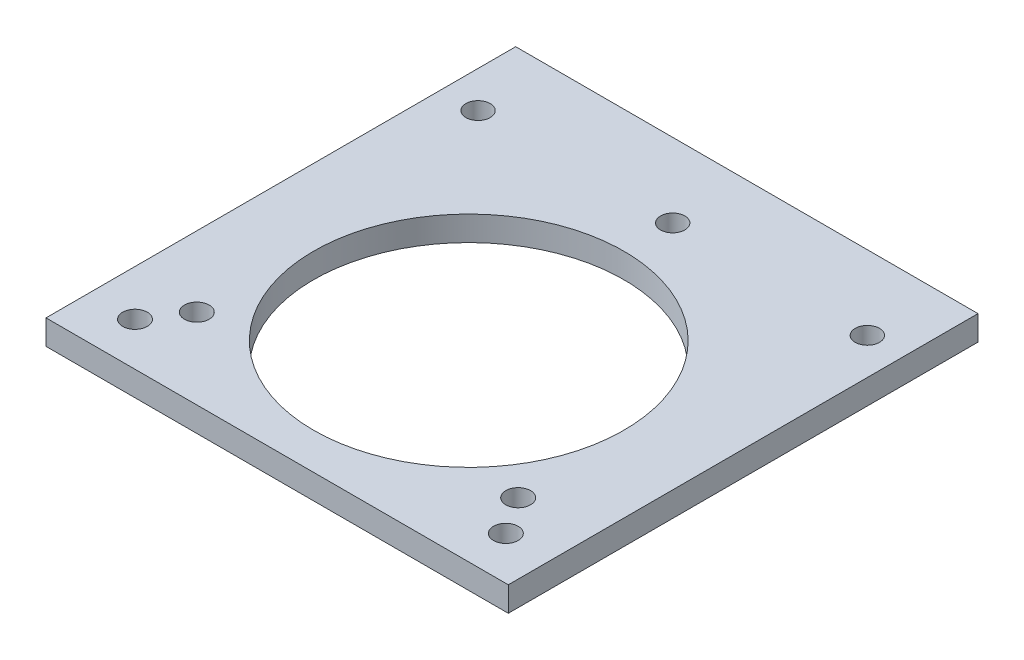
ISO-10303-21;
HEADER;
FILE_DESCRIPTION(('STEP AP214'),'2;1');
FILE_NAME('part.step','',(''),(''),'','','');
FILE_SCHEMA(('AUTOMOTIVE_DESIGN { 1 0 10303 214 1 1 1 1 }'));
ENDSEC;
DATA;
#1=APPLICATION_CONTEXT('core data for automotive mechanical design processes');
#2=APPLICATION_PROTOCOL_DEFINITION('international standard','automotive_design',2000,#1);
#3=PRODUCT_CONTEXT('',#1,'mechanical');
#4=PRODUCT('Part','Part','',(#3));
#5=PRODUCT_RELATED_PRODUCT_CATEGORY('part','',(#4));
#6=PRODUCT_DEFINITION_FORMATION('','',#4);
#7=PRODUCT_DEFINITION_CONTEXT('part definition',#1,'design');
#8=PRODUCT_DEFINITION('design','',#6,#7);
#9=PRODUCT_DEFINITION_SHAPE('','',#8);
#10=(LENGTH_UNIT() NAMED_UNIT(*) SI_UNIT(.MILLI.,.METRE.));
#11=(NAMED_UNIT(*) PLANE_ANGLE_UNIT() SI_UNIT($,.RADIAN.));
#12=(NAMED_UNIT(*) SI_UNIT($,.STERADIAN.) SOLID_ANGLE_UNIT());
#13=UNCERTAINTY_MEASURE_WITH_UNIT(LENGTH_MEASURE(1.E-05),#10,'distance_accuracy_value','');
#14=(GEOMETRIC_REPRESENTATION_CONTEXT(3) GLOBAL_UNCERTAINTY_ASSIGNED_CONTEXT((#13)) GLOBAL_UNIT_ASSIGNED_CONTEXT((#10,
#11,#12)) REPRESENTATION_CONTEXT('',''));
#15=CARTESIAN_POINT('',(0.,0.,0.));
#16=DIRECTION('',(0.,0.,1.));
#17=DIRECTION('',(1.,0.,0.));
#18=AXIS2_PLACEMENT_3D('',#15,#16,#17);
#19=CARTESIAN_POINT('',(-47.5,5.08,-35.56));
#20=DIRECTION('',(0.,0.,1.));
#21=DIRECTION('',(1.,0.,0.));
#22=AXIS2_PLACEMENT_3D('',#19,#20,#21);
#23=PLANE('',#22);
#24=DIRECTION('',(-1.,0.,0.));
#25=VECTOR('',#24,1.);
#26=CARTESIAN_POINT('',(-47.5,0.,-35.56));
#27=LINE('',#26,#25);
#28=CARTESIAN_POINT('',(47.5,0.,-35.56));
#29=VERTEX_POINT('',#28);
#30=CARTESIAN_POINT('',(-47.5,0.,-35.56));
#31=VERTEX_POINT('',#30);
#32=EDGE_CURVE('E116',#29,#31,#27,.T.);
#33=ORIENTED_EDGE('',*,*,#32,.T.);
#34=DIRECTION('',(0.,-1.,0.));
#35=VECTOR('',#34,1.);
#36=CARTESIAN_POINT('',(-47.5,5.08,-35.56));
#37=LINE('',#36,#35);
#38=CARTESIAN_POINT('',(-47.5,5.08,-35.56));
#39=VERTEX_POINT('',#38);
#40=EDGE_CURVE('E11',#39,#31,#37,.T.);
#41=ORIENTED_EDGE('',*,*,#40,.F.);
#42=DIRECTION('',(-1.,0.,0.));
#43=VECTOR('',#42,1.);
#44=CARTESIAN_POINT('',(-47.5,5.08,-35.56));
#45=LINE('',#44,#43);
#46=CARTESIAN_POINT('',(47.5,5.08,-35.56));
#47=VERTEX_POINT('',#46);
#48=EDGE_CURVE('E99',#47,#39,#45,.T.);
#49=ORIENTED_EDGE('',*,*,#48,.F.);
#50=DIRECTION('',(0.,-1.,0.));
#51=VECTOR('',#50,1.);
#52=CARTESIAN_POINT('',(47.5,5.08,-35.56));
#53=LINE('',#52,#51);
#54=EDGE_CURVE('E112',#47,#29,#53,.T.);
#55=ORIENTED_EDGE('',*,*,#54,.T.);
#56=EDGE_LOOP('',(#33,#41,#49,#55));
#57=FACE_BOUND('',#56,.T.);
#58=ADVANCED_FACE('F45',(#57),#23,.F.);
#59=CARTESIAN_POINT('',(-47.5,5.08,60.96));
#60=DIRECTION('',(1.,0.,0.));
#61=DIRECTION('',(0.,0.,-1.));
#62=AXIS2_PLACEMENT_3D('',#59,#60,#61);
#63=PLANE('',#62);
#64=DIRECTION('',(0.,0.,1.));
#65=VECTOR('',#64,1.);
#66=CARTESIAN_POINT('',(-47.5,0.,60.96));
#67=LINE('',#66,#65);
#68=CARTESIAN_POINT('',(-47.5,0.,60.96));
#69=VERTEX_POINT('',#68);
#70=EDGE_CURVE('E104',#31,#69,#67,.T.);
#71=ORIENTED_EDGE('',*,*,#70,.T.);
#72=DIRECTION('',(0.,-1.,0.));
#73=VECTOR('',#72,1.);
#74=CARTESIAN_POINT('',(-47.5,5.08,60.96));
#75=LINE('',#74,#73);
#76=CARTESIAN_POINT('',(-47.5,5.08,60.96));
#77=VERTEX_POINT('',#76);
#78=EDGE_CURVE('E55',#77,#69,#75,.T.);
#79=ORIENTED_EDGE('',*,*,#78,.F.);
#80=DIRECTION('',(0.,0.,1.));
#81=VECTOR('',#80,1.);
#82=CARTESIAN_POINT('',(-47.5,5.08,60.96));
#83=LINE('',#82,#81);
#84=EDGE_CURVE('E94',#39,#77,#83,.T.);
#85=ORIENTED_EDGE('',*,*,#84,.F.);
#86=ORIENTED_EDGE('',*,*,#40,.T.);
#87=EDGE_LOOP('',(#71,#79,#85,#86));
#88=FACE_BOUND('',#87,.T.);
#89=ADVANCED_FACE('F103',(#88),#63,.F.);
#90=CARTESIAN_POINT('',(-47.5,5.08,60.96));
#91=DIRECTION('',(0.,0.,-1.));
#92=DIRECTION('',(-1.,0.,0.));
#93=AXIS2_PLACEMENT_3D('',#90,#91,#92);
#94=PLANE('',#93);
#95=DIRECTION('',(1.,0.,0.));
#96=VECTOR('',#95,1.);
#97=CARTESIAN_POINT('',(-47.5,0.,60.96));
#98=LINE('',#97,#96);
#99=CARTESIAN_POINT('',(47.5,0.,60.96));
#100=VERTEX_POINT('',#99);
#101=EDGE_CURVE('E81',#69,#100,#98,.T.);
#102=ORIENTED_EDGE('',*,*,#101,.T.);
#103=DIRECTION('',(0.,-1.,0.));
#104=VECTOR('',#103,1.);
#105=CARTESIAN_POINT('',(47.5,5.08,60.96));
#106=LINE('',#105,#104);
#107=CARTESIAN_POINT('',(47.5,5.08,60.96));
#108=VERTEX_POINT('',#107);
#109=EDGE_CURVE('E106',#108,#100,#106,.T.);
#110=ORIENTED_EDGE('',*,*,#109,.F.);
#111=DIRECTION('',(1.,0.,0.));
#112=VECTOR('',#111,1.);
#113=CARTESIAN_POINT('',(-47.5,5.08,60.96));
#114=LINE('',#113,#112);
#115=EDGE_CURVE('E97',#77,#108,#114,.T.);
#116=ORIENTED_EDGE('',*,*,#115,.F.);
#117=ORIENTED_EDGE('',*,*,#78,.T.);
#118=EDGE_LOOP('',(#102,#110,#116,#117));
#119=FACE_BOUND('',#118,.T.);
#120=ADVANCED_FACE('F108',(#119),#94,.F.);
#121=CARTESIAN_POINT('',(47.5,5.08,60.96));
#122=DIRECTION('',(-1.,0.,0.));
#123=DIRECTION('',(0.,0.,1.));
#124=AXIS2_PLACEMENT_3D('',#121,#122,#123);
#125=PLANE('',#124);
#126=DIRECTION('',(0.,0.,-1.));
#127=VECTOR('',#126,1.);
#128=CARTESIAN_POINT('',(47.5,0.,60.96));
#129=LINE('',#128,#127);
#130=EDGE_CURVE('E87',#100,#29,#129,.T.);
#131=ORIENTED_EDGE('',*,*,#130,.T.);
#132=ORIENTED_EDGE('',*,*,#54,.F.);
#133=DIRECTION('',(0.,0.,-1.));
#134=VECTOR('',#133,1.);
#135=CARTESIAN_POINT('',(47.5,5.08,60.96));
#136=LINE('',#135,#134);
#137=EDGE_CURVE('E64',#108,#47,#136,.T.);
#138=ORIENTED_EDGE('',*,*,#137,.F.);
#139=ORIENTED_EDGE('',*,*,#109,.T.);
#140=EDGE_LOOP('',(#131,#132,#138,#139));
#141=FACE_BOUND('',#140,.T.);
#142=ADVANCED_FACE('F190',(#141),#125,.F.);
#143=CARTESIAN_POINT('',(0.,5.08,0.));
#144=DIRECTION('',(0.,1.,0.));
#145=DIRECTION('',(0.,0.,1.));
#146=AXIS2_PLACEMENT_3D('',#143,#144,#145);
#147=PLANE('',#146);
#148=CARTESIAN_POINT('',(33.02,5.08,44.45));
#149=DIRECTION('',(0.,1.,0.));
#150=DIRECTION('',(0.,0.,-1.));
#151=AXIS2_PLACEMENT_3D('',#148,#149,#150);
#152=CIRCLE('',#151,2.54);
#153=CARTESIAN_POINT('',(33.02,5.08,41.91));
#154=VERTEX_POINT('',#153);
#155=EDGE_CURVE('E301',#154,#154,#152,.T.);
#156=ORIENTED_EDGE('',*,*,#155,.F.);
#157=EDGE_LOOP('',(#156));
#158=FACE_BOUND('',#157,.T.);
#159=CARTESIAN_POINT('',(-38.1,5.08,52.07));
#160=DIRECTION('',(0.,1.,0.));
#161=DIRECTION('',(0.,0.,1.));
#162=AXIS2_PLACEMENT_3D('',#159,#160,#161);
#163=CIRCLE('',#162,2.54);
#164=CARTESIAN_POINT('',(-38.1,5.08,54.61));
#165=VERTEX_POINT('',#164);
#166=EDGE_CURVE('E303',#165,#165,#163,.T.);
#167=ORIENTED_EDGE('',*,*,#166,.F.);
#168=EDGE_LOOP('',(#167));
#169=FACE_BOUND('',#168,.T.);
#170=CARTESIAN_POINT('',(38.1,5.08,52.07));
#171=DIRECTION('',(0.,1.,0.));
#172=DIRECTION('',(0.,0.,-1.));
#173=AXIS2_PLACEMENT_3D('',#170,#171,#172);
#174=CIRCLE('',#173,2.54);
#175=CARTESIAN_POINT('',(38.1,5.08,49.53));
#176=VERTEX_POINT('',#175);
#177=EDGE_CURVE('E309',#176,#176,#174,.T.);
#178=ORIENTED_EDGE('',*,*,#177,.F.);
#179=EDGE_LOOP('',(#178));
#180=FACE_BOUND('',#179,.T.);
#181=CARTESIAN_POINT('',(-33.02,5.08,44.45));
#182=DIRECTION('',(0.,1.,0.));
#183=DIRECTION('',(0.,0.,1.));
#184=AXIS2_PLACEMENT_3D('',#181,#182,#183);
#185=CIRCLE('',#184,2.54);
#186=CARTESIAN_POINT('',(-33.02,5.08,46.99));
#187=VERTEX_POINT('',#186);
#188=EDGE_CURVE('E136',#187,#187,#185,.T.);
#189=ORIENTED_EDGE('',*,*,#188,.F.);
#190=EDGE_LOOP('',(#189));
#191=FACE_BOUND('',#190,.T.);
#192=CARTESIAN_POINT('',(-40.,5.08,-20.32));
#193=DIRECTION('',(0.,1.,0.));
#194=DIRECTION('',(0.,0.,1.));
#195=AXIS2_PLACEMENT_3D('',#192,#193,#194);
#196=CIRCLE('',#195,2.5);
#197=CARTESIAN_POINT('',(-40.,5.08,-17.82));
#198=VERTEX_POINT('',#197);
#199=EDGE_CURVE('E146',#198,#198,#196,.T.);
#200=ORIENTED_EDGE('',*,*,#199,.F.);
#201=EDGE_LOOP('',(#200));
#202=FACE_BOUND('',#201,.T.);
#203=CARTESIAN_POINT('',(40.,5.08,-20.32));
#204=DIRECTION('',(0.,1.,0.));
#205=DIRECTION('',(0.,0.,1.));
#206=AXIS2_PLACEMENT_3D('',#203,#204,#205);
#207=CIRCLE('',#206,2.5);
#208=CARTESIAN_POINT('',(40.,5.08,-17.82));
#209=VERTEX_POINT('',#208);
#210=EDGE_CURVE('E157',#209,#209,#207,.T.);
#211=ORIENTED_EDGE('',*,*,#210,.F.);
#212=EDGE_LOOP('',(#211));
#213=FACE_BOUND('',#212,.T.);
#214=CARTESIAN_POINT('',(0.,5.08,-20.32));
#215=DIRECTION('',(0.,1.,0.));
#216=DIRECTION('',(0.,0.,1.));
#217=AXIS2_PLACEMENT_3D('',#214,#215,#216);
#218=CIRCLE('',#217,2.5);
#219=CARTESIAN_POINT('',(0.,5.08,-17.82));
#220=VERTEX_POINT('',#219);
#221=EDGE_CURVE('E169',#220,#220,#218,.T.);
#222=ORIENTED_EDGE('',*,*,#221,.F.);
#223=EDGE_LOOP('',(#222));
#224=FACE_BOUND('',#223,.T.);
#225=CARTESIAN_POINT('',(0.,5.08,21.59));
#226=DIRECTION('',(0.,1.,0.));
#227=DIRECTION('',(0.,0.,1.));
#228=AXIS2_PLACEMENT_3D('',#225,#226,#227);
#229=CIRCLE('',#228,31.88);
#230=CARTESIAN_POINT('',(0.,5.08,53.47));
#231=VERTEX_POINT('',#230);
#232=EDGE_CURVE('E177',#231,#231,#229,.T.);
#233=ORIENTED_EDGE('',*,*,#232,.F.);
#234=EDGE_LOOP('',(#233));
#235=FACE_BOUND('',#234,.T.);
#236=ORIENTED_EDGE('',*,*,#48,.T.);
#237=ORIENTED_EDGE('',*,*,#84,.T.);
#238=ORIENTED_EDGE('',*,*,#115,.T.);
#239=ORIENTED_EDGE('',*,*,#137,.T.);
#240=EDGE_LOOP('',(#236,#237,#238,#239));
#241=FACE_BOUND('',#240,.T.);
#242=ADVANCED_FACE('F95',(#158,#169,#180,#191,#202,#213,#224,#235,#241),#147,.T.);
#243=CARTESIAN_POINT('',(0.,0.,0.));
#244=DIRECTION('',(0.,1.,0.));
#245=DIRECTION('',(0.,0.,1.));
#246=AXIS2_PLACEMENT_3D('',#243,#244,#245);
#247=PLANE('',#246);
#248=CARTESIAN_POINT('',(33.02,0.,44.45));
#249=DIRECTION('',(0.,1.,0.));
#250=DIRECTION('',(0.,0.,1.));
#251=AXIS2_PLACEMENT_3D('',#248,#249,#250);
#252=CIRCLE('',#251,2.54);
#253=CARTESIAN_POINT('',(33.02,0.,46.99));
#254=VERTEX_POINT('',#253);
#255=EDGE_CURVE('E48',#254,#254,#252,.T.);
#256=ORIENTED_EDGE('',*,*,#255,.T.);
#257=EDGE_LOOP('',(#256));
#258=FACE_BOUND('',#257,.T.);
#259=CARTESIAN_POINT('',(-38.1,0.,52.07));
#260=DIRECTION('',(0.,1.,0.));
#261=DIRECTION('',(0.,0.,1.));
#262=AXIS2_PLACEMENT_3D('',#259,#260,#261);
#263=CIRCLE('',#262,2.54);
#264=CARTESIAN_POINT('',(-38.1,0.,54.61));
#265=VERTEX_POINT('',#264);
#266=EDGE_CURVE('E139',#265,#265,#263,.T.);
#267=ORIENTED_EDGE('',*,*,#266,.T.);
#268=EDGE_LOOP('',(#267));
#269=FACE_BOUND('',#268,.T.);
#270=CARTESIAN_POINT('',(38.1,0.,52.07));
#271=DIRECTION('',(0.,1.,0.));
#272=DIRECTION('',(0.,0.,1.));
#273=AXIS2_PLACEMENT_3D('',#270,#271,#272);
#274=CIRCLE('',#273,2.54);
#275=CARTESIAN_POINT('',(38.1,0.,54.61));
#276=VERTEX_POINT('',#275);
#277=EDGE_CURVE('E135',#276,#276,#274,.T.);
#278=ORIENTED_EDGE('',*,*,#277,.T.);
#279=EDGE_LOOP('',(#278));
#280=FACE_BOUND('',#279,.T.);
#281=CARTESIAN_POINT('',(-33.02,0.,44.45));
#282=DIRECTION('',(0.,1.,0.));
#283=DIRECTION('',(0.,0.,1.));
#284=AXIS2_PLACEMENT_3D('',#281,#282,#283);
#285=CIRCLE('',#284,2.54);
#286=CARTESIAN_POINT('',(-33.02,0.,46.99));
#287=VERTEX_POINT('',#286);
#288=EDGE_CURVE('E131',#287,#287,#285,.T.);
#289=ORIENTED_EDGE('',*,*,#288,.T.);
#290=EDGE_LOOP('',(#289));
#291=FACE_BOUND('',#290,.T.);
#292=CARTESIAN_POINT('',(-40.,0.,-20.32));
#293=DIRECTION('',(0.,1.,0.));
#294=DIRECTION('',(0.,0.,1.));
#295=AXIS2_PLACEMENT_3D('',#292,#293,#294);
#296=CIRCLE('',#295,2.5);
#297=CARTESIAN_POINT('',(-40.,0.,-17.82));
#298=VERTEX_POINT('',#297);
#299=EDGE_CURVE('E151',#298,#298,#296,.T.);
#300=ORIENTED_EDGE('',*,*,#299,.T.);
#301=EDGE_LOOP('',(#300));
#302=FACE_BOUND('',#301,.T.);
#303=CARTESIAN_POINT('',(40.,0.,-20.32));
#304=DIRECTION('',(0.,1.,0.));
#305=DIRECTION('',(0.,0.,1.));
#306=AXIS2_PLACEMENT_3D('',#303,#304,#305);
#307=CIRCLE('',#306,2.5);
#308=CARTESIAN_POINT('',(40.,0.,-17.82));
#309=VERTEX_POINT('',#308);
#310=EDGE_CURVE('E165',#309,#309,#307,.T.);
#311=ORIENTED_EDGE('',*,*,#310,.T.);
#312=EDGE_LOOP('',(#311));
#313=FACE_BOUND('',#312,.T.);
#314=CARTESIAN_POINT('',(0.,0.,-20.32));
#315=DIRECTION('',(0.,1.,0.));
#316=DIRECTION('',(0.,0.,1.));
#317=AXIS2_PLACEMENT_3D('',#314,#315,#316);
#318=CIRCLE('',#317,2.5);
#319=CARTESIAN_POINT('',(0.,0.,-17.82));
#320=VERTEX_POINT('',#319);
#321=EDGE_CURVE('E173',#320,#320,#318,.T.);
#322=ORIENTED_EDGE('',*,*,#321,.T.);
#323=EDGE_LOOP('',(#322));
#324=FACE_BOUND('',#323,.T.);
#325=CARTESIAN_POINT('',(0.,0.,21.59));
#326=DIRECTION('',(0.,1.,0.));
#327=DIRECTION('',(0.,0.,1.));
#328=AXIS2_PLACEMENT_3D('',#325,#326,#327);
#329=CIRCLE('',#328,31.88);
#330=CARTESIAN_POINT('',(0.,0.,53.47));
#331=VERTEX_POINT('',#330);
#332=EDGE_CURVE('E120',#331,#331,#329,.T.);
#333=ORIENTED_EDGE('',*,*,#332,.T.);
#334=EDGE_LOOP('',(#333));
#335=FACE_BOUND('',#334,.T.);
#336=ORIENTED_EDGE('',*,*,#32,.F.);
#337=ORIENTED_EDGE('',*,*,#130,.F.);
#338=ORIENTED_EDGE('',*,*,#101,.F.);
#339=ORIENTED_EDGE('',*,*,#70,.F.);
#340=EDGE_LOOP('',(#336,#337,#338,#339));
#341=FACE_BOUND('',#340,.T.);
#342=ADVANCED_FACE('F189',(#258,#269,#280,#291,#302,#313,#324,#335,#341),#247,.F.);
#343=CARTESIAN_POINT('',(0.,0.,21.59));
#344=DIRECTION('',(0.,1.,0.));
#345=DIRECTION('',(0.,0.,1.));
#346=AXIS2_PLACEMENT_3D('',#343,#344,#345);
#347=CYLINDRICAL_SURFACE('',#346,31.88);
#348=ORIENTED_EDGE('',*,*,#332,.F.);
#349=EDGE_LOOP('',(#348));
#350=FACE_BOUND('',#349,.T.);
#351=ORIENTED_EDGE('',*,*,#232,.T.);
#352=EDGE_LOOP('',(#351));
#353=FACE_BOUND('',#352,.T.);
#354=ADVANCED_FACE('F186',(#350,#353),#347,.F.);
#355=CARTESIAN_POINT('',(0.,5.08,-20.32));
#356=DIRECTION('',(0.,1.,0.));
#357=DIRECTION('',(0.,0.,1.));
#358=AXIS2_PLACEMENT_3D('',#355,#356,#357);
#359=CYLINDRICAL_SURFACE('',#358,2.5);
#360=ORIENTED_EDGE('',*,*,#321,.F.);
#361=EDGE_LOOP('',(#360));
#362=FACE_BOUND('',#361,.T.);
#363=ORIENTED_EDGE('',*,*,#221,.T.);
#364=EDGE_LOOP('',(#363));
#365=FACE_BOUND('',#364,.T.);
#366=ADVANCED_FACE('F228',(#362,#365),#359,.F.);
#367=CARTESIAN_POINT('',(40.,5.08,-20.32));
#368=DIRECTION('',(0.,1.,0.));
#369=DIRECTION('',(0.,0.,1.));
#370=AXIS2_PLACEMENT_3D('',#367,#368,#369);
#371=CYLINDRICAL_SURFACE('',#370,2.5);
#372=ORIENTED_EDGE('',*,*,#310,.F.);
#373=EDGE_LOOP('',(#372));
#374=FACE_BOUND('',#373,.T.);
#375=ORIENTED_EDGE('',*,*,#210,.T.);
#376=EDGE_LOOP('',(#375));
#377=FACE_BOUND('',#376,.T.);
#378=ADVANCED_FACE('F237',(#374,#377),#371,.F.);
#379=CARTESIAN_POINT('',(-40.,5.08,-20.32));
#380=DIRECTION('',(0.,1.,0.));
#381=DIRECTION('',(0.,0.,1.));
#382=AXIS2_PLACEMENT_3D('',#379,#380,#381);
#383=CYLINDRICAL_SURFACE('',#382,2.5);
#384=ORIENTED_EDGE('',*,*,#299,.F.);
#385=EDGE_LOOP('',(#384));
#386=FACE_BOUND('',#385,.T.);
#387=ORIENTED_EDGE('',*,*,#199,.T.);
#388=EDGE_LOOP('',(#387));
#389=FACE_BOUND('',#388,.T.);
#390=ADVANCED_FACE('F245',(#386,#389),#383,.F.);
#391=CARTESIAN_POINT('',(-33.02,-2.54,44.45));
#392=DIRECTION('',(0.,1.,0.));
#393=DIRECTION('',(0.,0.,1.));
#394=AXIS2_PLACEMENT_3D('',#391,#392,#393);
#395=CYLINDRICAL_SURFACE('',#394,2.54);
#396=ORIENTED_EDGE('',*,*,#188,.T.);
#397=EDGE_LOOP('',(#396));
#398=FACE_BOUND('',#397,.T.);
#399=ORIENTED_EDGE('',*,*,#288,.F.);
#400=EDGE_LOOP('',(#399));
#401=FACE_BOUND('',#400,.T.);
#402=ADVANCED_FACE('F253',(#398,#401),#395,.F.);
#403=CARTESIAN_POINT('',(38.1,-2.54,52.07));
#404=DIRECTION('',(0.,1.,0.));
#405=DIRECTION('',(0.,0.,1.));
#406=AXIS2_PLACEMENT_3D('',#403,#404,#405);
#407=CYLINDRICAL_SURFACE('',#406,2.54);
#408=ORIENTED_EDGE('',*,*,#177,.T.);
#409=EDGE_LOOP('',(#408));
#410=FACE_BOUND('',#409,.T.);
#411=ORIENTED_EDGE('',*,*,#277,.F.);
#412=EDGE_LOOP('',(#411));
#413=FACE_BOUND('',#412,.T.);
#414=ADVANCED_FACE('F266',(#410,#413),#407,.F.);
#415=CARTESIAN_POINT('',(-38.1,-2.54,52.07));
#416=DIRECTION('',(0.,1.,0.));
#417=DIRECTION('',(0.,0.,1.));
#418=AXIS2_PLACEMENT_3D('',#415,#416,#417);
#419=CYLINDRICAL_SURFACE('',#418,2.54);
#420=ORIENTED_EDGE('',*,*,#166,.T.);
#421=EDGE_LOOP('',(#420));
#422=FACE_BOUND('',#421,.T.);
#423=ORIENTED_EDGE('',*,*,#266,.F.);
#424=EDGE_LOOP('',(#423));
#425=FACE_BOUND('',#424,.T.);
#426=ADVANCED_FACE('F276',(#422,#425),#419,.F.);
#427=CARTESIAN_POINT('',(33.02,-2.54,44.45));
#428=DIRECTION('',(0.,1.,0.));
#429=DIRECTION('',(0.,0.,1.));
#430=AXIS2_PLACEMENT_3D('',#427,#428,#429);
#431=CYLINDRICAL_SURFACE('',#430,2.54);
#432=ORIENTED_EDGE('',*,*,#155,.T.);
#433=EDGE_LOOP('',(#432));
#434=FACE_BOUND('',#433,.T.);
#435=ORIENTED_EDGE('',*,*,#255,.F.);
#436=EDGE_LOOP('',(#435));
#437=FACE_BOUND('',#436,.T.);
#438=ADVANCED_FACE('F286',(#434,#437),#431,.F.);
#439=CLOSED_SHELL('',(#58,#89,#120,#142,#242,#342,#354,#366,#378,#390,#402,#414,#426,#438));
#440=MANIFOLD_SOLID_BREP('B2',#439);
#441=ADVANCED_BREP_SHAPE_REPRESENTATION('',(#18,#440),#14);
#442=SHAPE_DEFINITION_REPRESENTATION(#9,#441);
ENDSEC;
END-ISO-10303-21;
